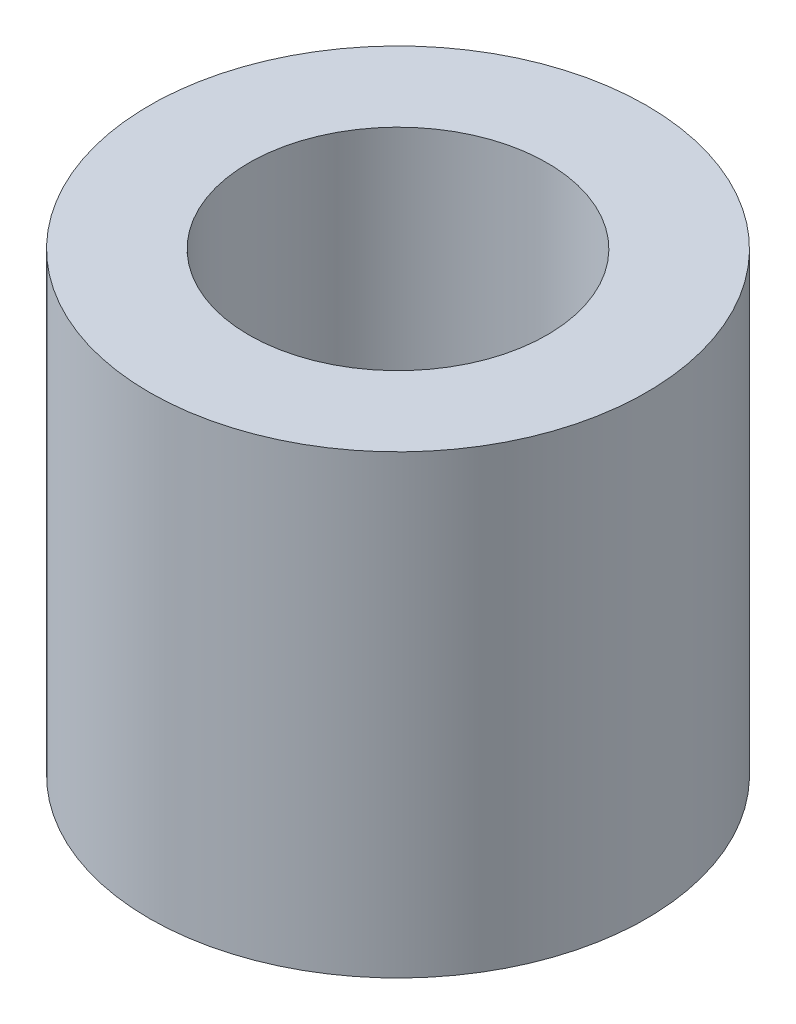
ISO-10303-21;
HEADER;
FILE_DESCRIPTION(('STEP AP214'),'2;1');
FILE_NAME('part.step','',(''),(''),'','','');
FILE_SCHEMA(('AUTOMOTIVE_DESIGN { 1 0 10303 214 1 1 1 1 }'));
ENDSEC;
DATA;
#1=APPLICATION_CONTEXT('core data for automotive mechanical design processes');
#2=APPLICATION_PROTOCOL_DEFINITION('international standard','automotive_design',2000,#1);
#3=PRODUCT_CONTEXT('',#1,'mechanical');
#4=PRODUCT('Part','Part','',(#3));
#5=PRODUCT_RELATED_PRODUCT_CATEGORY('part','',(#4));
#6=PRODUCT_DEFINITION_FORMATION('','',#4);
#7=PRODUCT_DEFINITION_CONTEXT('part definition',#1,'design');
#8=PRODUCT_DEFINITION('design','',#6,#7);
#9=PRODUCT_DEFINITION_SHAPE('','',#8);
#10=(LENGTH_UNIT() NAMED_UNIT(*) SI_UNIT(.MILLI.,.METRE.));
#11=(NAMED_UNIT(*) PLANE_ANGLE_UNIT() SI_UNIT($,.RADIAN.));
#12=(NAMED_UNIT(*) SI_UNIT($,.STERADIAN.) SOLID_ANGLE_UNIT());
#13=UNCERTAINTY_MEASURE_WITH_UNIT(LENGTH_MEASURE(1.E-05),#10,'distance_accuracy_value','');
#14=(GEOMETRIC_REPRESENTATION_CONTEXT(3) GLOBAL_UNCERTAINTY_ASSIGNED_CONTEXT((#13)) GLOBAL_UNIT_ASSIGNED_CONTEXT((#10,
#11,#12)) REPRESENTATION_CONTEXT('',''));
#15=CARTESIAN_POINT('',(0.,0.,0.));
#16=DIRECTION('',(0.,0.,1.));
#17=DIRECTION('',(1.,0.,0.));
#18=AXIS2_PLACEMENT_3D('',#15,#16,#17);
#19=CARTESIAN_POINT('',(0.,5.5,0.));
#20=DIRECTION('',(0.,1.,0.));
#21=DIRECTION('',(0.,0.,1.));
#22=AXIS2_PLACEMENT_3D('',#19,#20,#21);
#23=PLANE('',#22);
#24=CARTESIAN_POINT('',(0.,5.5,0.));
#25=DIRECTION('',(0.,1.,0.));
#26=DIRECTION('',(0.,0.,1.));
#27=AXIS2_PLACEMENT_3D('',#24,#25,#26);
#28=CIRCLE('',#27,3.);
#29=CARTESIAN_POINT('',(0.,5.5,3.));
#30=VERTEX_POINT('',#29);
#31=EDGE_CURVE('E10',#30,#30,#28,.T.);
#32=ORIENTED_EDGE('',*,*,#31,.T.);
#33=EDGE_LOOP('',(#32));
#34=FACE_BOUND('',#33,.T.);
#35=CARTESIAN_POINT('',(0.,5.5,0.));
#36=DIRECTION('',(0.,1.,0.));
#37=DIRECTION('',(0.,0.,1.));
#38=AXIS2_PLACEMENT_3D('',#35,#36,#37);
#39=CIRCLE('',#38,1.8);
#40=CARTESIAN_POINT('',(0.,5.5,1.8));
#41=VERTEX_POINT('',#40);
#42=EDGE_CURVE('E42',#41,#41,#39,.T.);
#43=ORIENTED_EDGE('',*,*,#42,.F.);
#44=EDGE_LOOP('',(#43));
#45=FACE_BOUND('',#44,.T.);
#46=ADVANCED_FACE('F31',(#34,#45),#23,.T.);
#47=CARTESIAN_POINT('',(0.,0.,0.));
#48=DIRECTION('',(0.,1.,0.));
#49=DIRECTION('',(0.,0.,1.));
#50=AXIS2_PLACEMENT_3D('',#47,#48,#49);
#51=PLANE('',#50);
#52=CARTESIAN_POINT('',(0.,0.,0.));
#53=DIRECTION('',(0.,1.,0.));
#54=DIRECTION('',(0.,0.,1.));
#55=AXIS2_PLACEMENT_3D('',#52,#53,#54);
#56=CIRCLE('',#55,3.);
#57=CARTESIAN_POINT('',(0.,0.,3.));
#58=VERTEX_POINT('',#57);
#59=EDGE_CURVE('E35',#58,#58,#56,.T.);
#60=ORIENTED_EDGE('',*,*,#59,.F.);
#61=EDGE_LOOP('',(#60));
#62=FACE_BOUND('',#61,.T.);
#63=CARTESIAN_POINT('',(0.,0.,0.));
#64=DIRECTION('',(0.,1.,0.));
#65=DIRECTION('',(0.,0.,1.));
#66=AXIS2_PLACEMENT_3D('',#63,#64,#65);
#67=CIRCLE('',#66,1.8);
#68=CARTESIAN_POINT('',(0.,0.,1.8));
#69=VERTEX_POINT('',#68);
#70=EDGE_CURVE('E44',#69,#69,#67,.T.);
#71=ORIENTED_EDGE('',*,*,#70,.T.);
#72=EDGE_LOOP('',(#71));
#73=FACE_BOUND('',#72,.T.);
#74=ADVANCED_FACE('F54',(#62,#73),#51,.F.);
#75=CARTESIAN_POINT('',(0.,5.5,0.));
#76=DIRECTION('',(0.,-1.,0.));
#77=DIRECTION('',(0.,0.,-1.));
#78=AXIS2_PLACEMENT_3D('',#75,#76,#77);
#79=CYLINDRICAL_SURFACE('',#78,3.);
#80=ORIENTED_EDGE('',*,*,#31,.F.);
#81=EDGE_LOOP('',(#80));
#82=FACE_BOUND('',#81,.T.);
#83=ORIENTED_EDGE('',*,*,#59,.T.);
#84=EDGE_LOOP('',(#83));
#85=FACE_BOUND('',#84,.T.);
#86=ADVANCED_FACE('F33',(#82,#85),#79,.T.);
#87=CARTESIAN_POINT('',(0.,5.5,0.));
#88=DIRECTION('',(0.,-1.,0.));
#89=DIRECTION('',(0.,0.,-1.));
#90=AXIS2_PLACEMENT_3D('',#87,#88,#89);
#91=CYLINDRICAL_SURFACE('',#90,1.8);
#92=ORIENTED_EDGE('',*,*,#42,.T.);
#93=EDGE_LOOP('',(#92));
#94=FACE_BOUND('',#93,.T.);
#95=ORIENTED_EDGE('',*,*,#70,.F.);
#96=EDGE_LOOP('',(#95));
#97=FACE_BOUND('',#96,.T.);
#98=ADVANCED_FACE('F50',(#94,#97),#91,.F.);
#99=CLOSED_SHELL('',(#46,#74,#86,#98));
#100=MANIFOLD_SOLID_BREP('B2',#99);
#101=ADVANCED_BREP_SHAPE_REPRESENTATION('',(#18,#100),#14);
#102=SHAPE_DEFINITION_REPRESENTATION(#9,#101);
ENDSEC;
END-ISO-10303-21;
